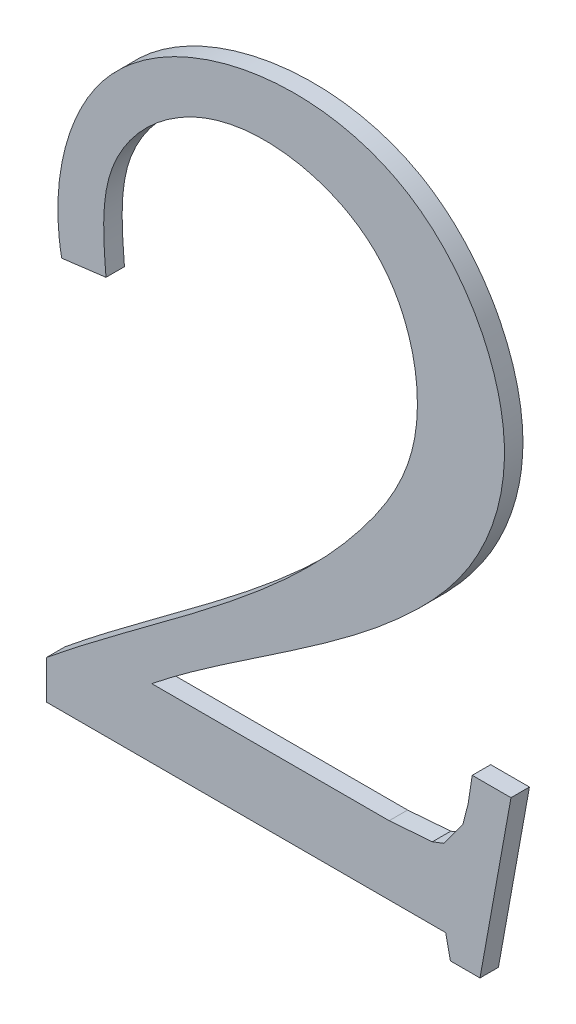
ISO-10303-21;
HEADER;
FILE_DESCRIPTION(('STEP AP214'),'2;1');
FILE_NAME('part.step','',(''),(''),'','','');
FILE_SCHEMA(('AUTOMOTIVE_DESIGN { 1 0 10303 214 1 1 1 1 }'));
ENDSEC;
DATA;
#1=APPLICATION_CONTEXT('core data for automotive mechanical design processes');
#2=APPLICATION_PROTOCOL_DEFINITION('international standard','automotive_design',2000,#1);
#3=PRODUCT_CONTEXT('',#1,'mechanical');
#4=PRODUCT('Part','Part','',(#3));
#5=PRODUCT_RELATED_PRODUCT_CATEGORY('part','',(#4));
#6=PRODUCT_DEFINITION_FORMATION('','',#4);
#7=PRODUCT_DEFINITION_CONTEXT('part definition',#1,'design');
#8=PRODUCT_DEFINITION('design','',#6,#7);
#9=PRODUCT_DEFINITION_SHAPE('','',#8);
#10=(LENGTH_UNIT() NAMED_UNIT(*) SI_UNIT(.MILLI.,.METRE.));
#11=(NAMED_UNIT(*) PLANE_ANGLE_UNIT() SI_UNIT($,.RADIAN.));
#12=(NAMED_UNIT(*) SI_UNIT($,.STERADIAN.) SOLID_ANGLE_UNIT());
#13=UNCERTAINTY_MEASURE_WITH_UNIT(LENGTH_MEASURE(1.E-05),#10,'distance_accuracy_value','');
#14=(GEOMETRIC_REPRESENTATION_CONTEXT(3) GLOBAL_UNCERTAINTY_ASSIGNED_CONTEXT((#13)) GLOBAL_UNIT_ASSIGNED_CONTEXT((#10,
#11,#12)) REPRESENTATION_CONTEXT('',''));
#15=CARTESIAN_POINT('',(0.,0.,0.));
#16=DIRECTION('',(0.,0.,1.));
#17=DIRECTION('',(1.,0.,0.));
#18=AXIS2_PLACEMENT_3D('',#15,#16,#17);
#19=CARTESIAN_POINT('',(0.,0.,0.05));
#20=DIRECTION('',(0.,0.,1.));
#21=DIRECTION('',(1.,0.,0.));
#22=AXIS2_PLACEMENT_3D('',#19,#20,#21);
#23=PLANE('',#22);
#24=CARTESIAN_POINT('',(3.09899999999998,-4.36099999999998,0.05));
#25=CARTESIAN_POINT('',(3.13352939431204,-4.3327277034328,0.05));
#26=CARTESIAN_POINT('',(3.16859484674987,-4.30514232488273,0.05));
#27=CARTESIAN_POINT('',(3.24012551636679,-4.25019745401624,0.05));
#28=CARTESIAN_POINT('',(3.27660459198674,-4.22285590486818,0.05));
#29=CARTESIAN_POINT('',(3.35027664214488,-4.16803937278579,0.05));
#30=CARTESIAN_POINT('',(3.38747233591294,-4.14056813136608,0.05));
#31=CARTESIAN_POINT('',(3.46187159716486,-4.08508870911011,0.05));
#32=CARTESIAN_POINT('',(3.49907336606711,-4.05707810668871,0.05));
#33=CARTESIAN_POINT('',(3.58193182663043,-3.99299562256812,0.05));
#34=CARTESIAN_POINT('',(3.62738534822964,-3.95665427807258,0.05));
#35=CARTESIAN_POINT('',(3.69375434500388,-3.90030765946178,0.05));
#36=CARTESIAN_POINT('',(3.71550353441927,-3.8812884015239,0.05));
#37=CARTESIAN_POINT('',(3.75830038447143,-3.84248086494116,0.05));
#38=CARTESIAN_POINT('',(3.77934818035898,-3.82269273617161,0.05));
#39=CARTESIAN_POINT('',(3.82037563149314,-3.7824350949379,0.05));
#40=CARTESIAN_POINT('',(3.84036383369619,-3.76197432585636,0.05));
#41=CARTESIAN_POINT('',(3.87932891248886,-3.72008487483054,0.05));
#42=CARTESIAN_POINT('',(3.89830523095192,-3.69865567052018,0.05));
#43=CARTESIAN_POINT('',(3.93495485714113,-3.65491457192806,0.05));
#44=CARTESIAN_POINT('',(3.95263478145768,-3.63260820529018,0.05));
#45=CARTESIAN_POINT('',(3.98658962397587,-3.58695907215511,0.05));
#46=CARTESIAN_POINT('',(4.00286606582264,-3.56361747231591,0.05));
#47=CARTESIAN_POINT('',(4.02568406306437,-3.52698506960837,0.05));
#48=CARTESIAN_POINT('',(4.03313861850895,-3.51426801070885,0.05));
#49=CARTESIAN_POINT('',(4.04720670900218,-3.48836266928158,0.05));
#50=CARTESIAN_POINT('',(4.05381973812304,-3.47517410933174,0.05));
#51=CARTESIAN_POINT('',(4.06591312810024,-3.44852618288967,0.05));
#52=CARTESIAN_POINT('',(4.07140926976051,-3.43507404633969,0.05));
#53=CARTESIAN_POINT('',(4.08121341058867,-3.40774348036995,0.05));
#54=CARTESIAN_POINT('',(4.08552177760331,-3.39386518441235,0.05));
#55=CARTESIAN_POINT('',(4.09282773279379,-3.3655280341554,0.05));
#56=CARTESIAN_POINT('',(4.09580340967906,-3.35106345940812,0.05));
#57=CARTESIAN_POINT('',(4.1003219855739,-3.32191491786917,0.05));
#58=CARTESIAN_POINT('',(4.1018643901066,-3.30723087713598,0.05));
#59=CARTESIAN_POINT('',(4.10447406804248,-3.26290643275941,0.05));
#60=CARTESIAN_POINT('',(4.10349267488836,-3.23312037481816,0.05));
#61=CARTESIAN_POINT('',(4.09657883772587,-3.17728059686551,0.05));
#62=CARTESIAN_POINT('',(4.09116817215635,-3.15115910553392,0.05));
#63=CARTESIAN_POINT('',(4.07587544287844,-3.10028665379651,0.05));
#64=CARTESIAN_POINT('',(4.06600672510193,-3.07553184843055,0.05));
#65=CARTESIAN_POINT('',(4.04483056113595,-3.03488848277747,0.05));
#66=CARTESIAN_POINT('',(4.03464201846329,-3.01841803732987,0.05));
#67=CARTESIAN_POINT('',(4.01163128664711,-2.98745734181578,0.05));
#68=CARTESIAN_POINT('',(3.99881569460674,-2.97296228004535,0.05));
#69=CARTESIAN_POINT('',(3.97078672731446,-2.94653102046192,0.05));
#70=CARTESIAN_POINT('',(3.95557344244173,-2.93459472623817,0.05));
#71=CARTESIAN_POINT('',(3.92344944002342,-2.91322641897108,0.05));
#72=CARTESIAN_POINT('',(3.90653389152021,-2.90380182687332,0.05));
#73=CARTESIAN_POINT('',(3.8657601065753,-2.88467382170508,0.05));
#74=CARTESIAN_POINT('',(3.84145948955657,-2.87591399434617,0.05));
#75=CARTESIAN_POINT('',(3.79177492697576,-2.86242790524104,0.05));
#76=CARTESIAN_POINT('',(3.76639002010206,-2.85770530417133,0.05));
#77=CARTESIAN_POINT('',(3.71483564264308,-2.85221661668814,0.05));
#78=CARTESIAN_POINT('',(3.68866019164282,-2.8515054568803,0.05));
#79=CARTESIAN_POINT('',(3.63655699634342,-2.85443952630193,0.05));
#80=CARTESIAN_POINT('',(3.61062913051664,-2.85808249439183,0.05));
#81=CARTESIAN_POINT('',(3.55935577427501,-2.8698894318201,0.05));
#82=CARTESIAN_POINT('',(3.53402710811174,-2.87812748292118,0.05));
#83=CARTESIAN_POINT('',(3.48526811110966,-2.89906560170328,0.05));
#84=CARTESIAN_POINT('',(3.46183906811663,-2.91176866581249,0.05));
#85=CARTESIAN_POINT('',(3.41882121675557,-2.94017818275806,0.05));
#86=CARTESIAN_POINT('',(3.39908893558122,-2.95566946636874,0.05));
#87=CARTESIAN_POINT('',(3.36241056878512,-2.98971400914532,0.05));
#88=CARTESIAN_POINT('',(3.34546653766641,-3.00826950616475,0.05));
#89=CARTESIAN_POINT('',(3.31793918809514,-3.04448321980532,0.05));
#90=CARTESIAN_POINT('',(3.30675942572382,-3.06168860919573,0.05));
#91=CARTESIAN_POINT('',(3.28739349142965,-3.09762852677776,0.05));
#92=CARTESIAN_POINT('',(3.27919093735984,-3.11635397105443,0.05));
#93=CARTESIAN_POINT('',(3.26958309727899,-3.14531152909724,0.05));
#94=CARTESIAN_POINT('',(3.26682988188559,-3.1551084656402,0.05));
#95=CARTESIAN_POINT('',(3.26221666821646,-3.17491207261595,0.05));
#96=CARTESIAN_POINT('',(3.26035695093026,-3.18491880799564,0.05));
#97=CARTESIAN_POINT('',(3.25587791167506,-3.21525329239229,0.05));
#98=CARTESIAN_POINT('',(3.25440371613718,-3.23574702536791,0.05));
#99=CARTESIAN_POINT('',(3.25339984089036,-3.27861167494059,0.05));
#100=CARTESIAN_POINT('',(3.25406113847422,-3.30098217108514,0.05));
#101=CARTESIAN_POINT('',(3.25650517279278,-3.34525057987553,0.05));
#102=CARTESIAN_POINT('',(3.25826663363007,-3.36714948358053,0.05));
#103=CARTESIAN_POINT('',(3.25999999999978,-3.38899999999532,0.05));
#104=B_SPLINE_CURVE_WITH_KNOTS('',3,(#24,#25,#26,#27,#28,#29,#30,#31,#32,#33,#34,#35,#36,#37,
#38,#39,#40,#41,#42,#43,#44,#45,#46,#47,#48,#49,#50,#51,#52,#53,#54,#55,#56,#57,#58,#59,#60,#61,
#62,#63,#64,#65,#66,#67,#68,#69,#70,#71,#72,#73,#74,#75,#76,#77,#78,#79,#80,#81,#82,#83,#84,#85,
#86,#87,#88,#89,#90,#91,#92,#93,#94,#95,#96,#97,#98,#99,#100,#101,#102,#103),.UNSPECIFIED.,.F.,
.F.,(4,2,2,2,2,2,2,2,2,2,2,2,2,2,2,2,2,2,2,2,2,2,2,2,2,2,2,2,2,2,2,2,2,2,2,2,2,2,2,4),(0.,
0.133845647964419,0.270600611062185,0.40932346862283,0.549025763928562,0.723540252798424,
0.810201759353854,0.896846456984278,0.982628673984437,1.06845772674373,1.15381283145847,
1.23907407485389,1.28327082380873,1.32749401967359,1.37104064706072,1.41457377312762,
1.45879849581211,1.50303847030282,1.59190383336916,1.67159177449509,1.7510427212379,
1.80891288021117,1.86663945659107,1.92436385753232,1.98225696332462,2.05934478747787,
2.13650243560371,2.21471404584981,2.29288505771214,2.37235436568433,2.45187710690576,
2.52681883411,2.60181553672056,2.66314364806958,2.72412899251449,2.75461879569307,
2.78511818111494,2.84657644461402,2.91367789009511,2.97952022189874),.UNSPECIFIED.);
#105=CARTESIAN_POINT('',(3.09899999999999,-4.36099999999999,0.05));
#106=VERTEX_POINT('',#105);
#107=CARTESIAN_POINT('',(3.25999999999997,-3.38899999999765,0.05));
#108=VERTEX_POINT('',#107);
#109=EDGE_CURVE('E152',#106,#108,#104,.T.);
#110=ORIENTED_EDGE('',*,*,#109,.F.);
#111=DIRECTION('',(0.,1.,0.));
#112=VECTOR('',#111,1.);
#113=CARTESIAN_POINT('',(3.099,-4.361,0.05));
#114=LINE('',#113,#112);
#115=CARTESIAN_POINT('',(3.099,-4.466,0.05));
#116=VERTEX_POINT('',#115);
#117=EDGE_CURVE('E149',#116,#106,#114,.T.);
#118=ORIENTED_EDGE('',*,*,#117,.F.);
#119=DIRECTION('',(1.,0.,0.));
#120=VECTOR('',#119,1.);
#121=CARTESIAN_POINT('',(3.099,-4.466,0.05));
#122=LINE('',#121,#120);
#123=CARTESIAN_POINT('',(4.18,-4.466,0.05));
#124=VERTEX_POINT('',#123);
#125=EDGE_CURVE('E140',#124,#116,#122,.F.);
#126=ORIENTED_EDGE('',*,*,#125,.F.);
#127=DIRECTION('',(0.2117533470058,-0.977323140026799,0.));
#128=VECTOR('',#127,1.);
#129=CARTESIAN_POINT('',(4.18,-4.466,0.05));
#130=LINE('',#129,#128);
#131=CARTESIAN_POINT('',(4.193,-4.526,0.05));
#132=VERTEX_POINT('',#131);
#133=EDGE_CURVE('E135',#132,#124,#130,.F.);
#134=ORIENTED_EDGE('',*,*,#133,.F.);
#135=DIRECTION('',(1.,0.,0.));
#136=VECTOR('',#135,1.);
#137=CARTESIAN_POINT('',(4.193,-4.526,0.05));
#138=LINE('',#137,#136);
#139=CARTESIAN_POINT('',(4.273,-4.526,0.05));
#140=VERTEX_POINT('',#139);
#141=EDGE_CURVE('E213',#140,#132,#138,.F.);
#142=ORIENTED_EDGE('',*,*,#141,.F.);
#143=DIRECTION('',(0.177767924449604,0.98407243891742,0.));
#144=VECTOR('',#143,1.);
#145=CARTESIAN_POINT('',(4.273,-4.526,0.05));
#146=LINE('',#145,#144);
#147=CARTESIAN_POINT('',(4.357,-4.061,0.05));
#148=VERTEX_POINT('',#147);
#149=EDGE_CURVE('E208',#148,#140,#146,.F.);
#150=ORIENTED_EDGE('',*,*,#149,.F.);
#151=DIRECTION('',(1.,0.,0.));
#152=VECTOR('',#151,1.);
#153=CARTESIAN_POINT('',(4.357,-4.061,0.05));
#154=LINE('',#153,#152);
#155=CARTESIAN_POINT('',(4.252,-4.061,0.05));
#156=VERTEX_POINT('',#155);
#157=EDGE_CURVE('E203',#156,#148,#154,.T.);
#158=ORIENTED_EDGE('',*,*,#157,.F.);
#159=DIRECTION('',(-0.151025398741503,-0.988529882671723,0.));
#160=VECTOR('',#159,1.);
#161=CARTESIAN_POINT('',(4.252,-4.061,0.05));
#162=LINE('',#161,#160);
#163=CARTESIAN_POINT('',(4.241,-4.133,0.05));
#164=VERTEX_POINT('',#163);
#165=EDGE_CURVE('E198',#164,#156,#162,.F.);
#166=ORIENTED_EDGE('',*,*,#165,.F.);
#167=DIRECTION('',(-0.246679280634912,-0.969097173922947,0.));
#168=VECTOR('',#167,1.);
#169=CARTESIAN_POINT('',(4.241,-4.133,0.05));
#170=LINE('',#169,#168);
#171=CARTESIAN_POINT('',(4.227,-4.188,0.05));
#172=VERTEX_POINT('',#171);
#173=EDGE_CURVE('E193',#172,#164,#170,.F.);
#174=ORIENTED_EDGE('',*,*,#173,.F.);
#175=DIRECTION('',(-0.590870941899023,-0.806766093746732,0.));
#176=VECTOR('',#175,1.);
#177=CARTESIAN_POINT('',(4.227,-4.188,0.05));
#178=LINE('',#177,#176);
#179=CARTESIAN_POINT('',(4.175,-4.259,0.05));
#180=VERTEX_POINT('',#179);
#181=EDGE_CURVE('E188',#180,#172,#178,.F.);
#182=ORIENTED_EDGE('',*,*,#181,.F.);
#183=DIRECTION('',(-0.932568098274095,-0.360994102557698,0.));
#184=VECTOR('',#183,1.);
#185=CARTESIAN_POINT('',(4.175,-4.259,0.05));
#186=LINE('',#185,#184);
#187=CARTESIAN_POINT('',(4.144,-4.271,0.05));
#188=VERTEX_POINT('',#187);
#189=EDGE_CURVE('E183',#188,#180,#186,.F.);
#190=ORIENTED_EDGE('',*,*,#189,.F.);
#191=DIRECTION('',(-0.997054485501581,-0.0766964988847386,0.));
#192=VECTOR('',#191,1.);
#193=CARTESIAN_POINT('',(4.144,-4.271,0.05));
#194=LINE('',#193,#192);
#195=CARTESIAN_POINT('',(4.027,-4.28,0.05));
#196=VERTEX_POINT('',#195);
#197=EDGE_CURVE('E178',#196,#188,#194,.F.);
#198=ORIENTED_EDGE('',*,*,#197,.F.);
#199=DIRECTION('',(1.,0.,0.));
#200=VECTOR('',#199,1.);
#201=CARTESIAN_POINT('',(4.027,-4.28,0.05));
#202=LINE('',#201,#200);
#203=CARTESIAN_POINT('',(3.3839999999999,-4.27999999999991,0.05));
#204=VERTEX_POINT('',#203);
#205=EDGE_CURVE('E76',#204,#196,#202,.T.);
#206=ORIENTED_EDGE('',*,*,#205,.F.);
#207=CARTESIAN_POINT('',(3.13999999999985,-3.40400000000003,0.05));
#208=CARTESIAN_POINT('',(3.1336319380678,-3.37132461745013,0.05));
#209=CARTESIAN_POINT('',(3.13023838823719,-3.33814098577875,0.05));
#210=CARTESIAN_POINT('',(3.12907710470549,-3.27156584397108,0.05));
#211=CARTESIAN_POINT('',(3.13132631759601,-3.23817400879364,0.05));
#212=CARTESIAN_POINT('',(3.1411478468347,-3.17229227837566,0.05));
#213=CARTESIAN_POINT('',(3.14870501721944,-3.13980008958831,0.05));
#214=CARTESIAN_POINT('',(3.16904594978592,-3.07651850993753,0.05));
#215=CARTESIAN_POINT('',(3.1818237281516,-3.04572721524143,0.05));
#216=CARTESIAN_POINT('',(3.21290644872305,-2.98644018770735,0.05));
#217=CARTESIAN_POINT('',(3.23128924081867,-2.95798445733268,0.05));
#218=CARTESIAN_POINT('',(3.27336314899692,-2.90534490298126,0.05));
#219=CARTESIAN_POINT('',(3.29705032766754,-2.88115793402156,0.05));
#220=CARTESIAN_POINT('',(3.3452100068164,-2.84008944276196,0.05));
#221=CARTESIAN_POINT('',(3.369241347045,-2.82267823190318,0.05));
#222=CARTESIAN_POINT('',(3.419533719719,-2.79142049869575,0.05));
#223=CARTESIAN_POINT('',(3.44579689603444,-2.77757745654272,0.05));
#224=CARTESIAN_POINT('',(3.5046010258046,-2.75124461460932,0.05));
#225=CARTESIAN_POINT('',(3.53743642033382,-2.73941527787589,0.05));
#226=CARTESIAN_POINT('',(3.60445022836033,-2.72041253930644,0.05));
#227=CARTESIAN_POINT('',(3.63863011406719,-2.71324440096033,0.05));
#228=CARTESIAN_POINT('',(3.71416806632083,-2.7028719679045,0.05));
#229=CARTESIAN_POINT('',(3.7556687845772,-2.70066480760537,0.05));
#230=CARTESIAN_POINT('',(3.83840294244927,-2.70378036166895,0.05));
#231=CARTESIAN_POINT('',(3.87963667380504,-2.70909259363159,0.05));
#232=CARTESIAN_POINT('',(3.94831843858288,-2.72536606046069,0.05));
#233=CARTESIAN_POINT('',(3.97626759355896,-2.7342175971058,0.05));
#234=CARTESIAN_POINT('',(4.03029913897755,-2.75639804950477,0.05));
#235=CARTESIAN_POINT('',(4.05638586238865,-2.76971613276512,0.05));
#236=CARTESIAN_POINT('',(4.10575641022146,-2.80092708681317,0.05));
#237=CARTESIAN_POINT('',(4.12903279699091,-2.81883172179467,0.05));
#238=CARTESIAN_POINT('',(4.17230789819218,-2.8582676194182,0.05));
#239=CARTESIAN_POINT('',(4.19230022526482,-2.87980578808093,0.05));
#240=CARTESIAN_POINT('',(4.22880224450531,-2.92565475400306,0.05));
#241=CARTESIAN_POINT('',(4.24531020403125,-2.94996692145188,0.05));
#242=CARTESIAN_POINT('',(4.2746515761528,-3.00072564562053,0.05));
#243=CARTESIAN_POINT('',(4.28748286361139,-3.02717342546224,0.05));
#244=CARTESIAN_POINT('',(4.31084594992179,-3.08579597327929,0.05));
#245=CARTESIAN_POINT('',(4.32073295857156,-3.11823063566766,0.05));
#246=CARTESIAN_POINT('',(4.33463078464326,-3.18437067226359,0.05));
#247=CARTESIAN_POINT('',(4.33864360200055,-3.21807560998073,0.05));
#248=CARTESIAN_POINT('',(4.33984649030719,-3.28353236883508,0.05));
#249=CARTESIAN_POINT('',(4.33744093861082,-3.31527684140705,0.05));
#250=CARTESIAN_POINT('',(4.32722259931463,-3.37785723626544,0.05));
#251=CARTESIAN_POINT('',(4.31940961501276,-3.40869312545847,0.05));
#252=CARTESIAN_POINT('',(4.30433604152708,-3.45336226967018,0.05));
#253=CARTESIAN_POINT('',(4.29883901816982,-3.46782082365801,0.05));
#254=CARTESIAN_POINT('',(4.28681873485304,-3.49628987638847,0.05));
#255=CARTESIAN_POINT('',(4.28029659392491,-3.51030084388619,0.05));
#256=CARTESIAN_POINT('',(4.2663043574938,-3.53781475641411,0.05));
#257=CARTESIAN_POINT('',(4.25883559492855,-3.55131838182578,0.05));
#258=CARTESIAN_POINT('',(4.24299546142959,-3.57778697744602,0.05));
#259=CARTESIAN_POINT('',(4.23462394460399,-3.59075186011928,0.05));
#260=CARTESIAN_POINT('',(4.1932377514839,-3.65062076367517,0.05));
#261=CARTESIAN_POINT('',(4.15509606919874,-3.69397841053866,0.05));
#262=CARTESIAN_POINT('',(4.09391735006805,-3.75513907107834,0.05));
#263=CARTESIAN_POINT('',(4.07270926369836,-3.7749984789705,0.05));
#264=CARTESIAN_POINT('',(4.02932866760596,-3.81362771732887,0.05));
#265=CARTESIAN_POINT('',(4.00715700709046,-3.83239847448485,0.05));
#266=CARTESIAN_POINT('',(3.95200306639138,-3.87714712805556,0.05));
#267=CARTESIAN_POINT('',(3.91860724374126,-3.90260805552536,0.05));
#268=CARTESIAN_POINT('',(3.85081270909551,-3.95220303239454,0.05));
#269=CARTESIAN_POINT('',(3.81641312914981,-3.97633587804089,0.05));
#270=CARTESIAN_POINT('',(3.74711318827527,-4.02393911260466,0.05));
#271=CARTESIAN_POINT('',(3.71221235303101,-4.0474088018517,0.05));
#272=CARTESIAN_POINT('',(3.64405716343579,-4.09324308169791,0.05));
#273=CARTESIAN_POINT('',(3.61080271862092,-4.11560763385671,0.05));
#274=CARTESIAN_POINT('',(3.54473010864882,-4.16091567184981,0.05));
#275=CARTESIAN_POINT('',(3.51191153617377,-4.18385854913529,0.05));
#276=CARTESIAN_POINT('',(3.44717417210813,-4.23090713830955,0.05));
#277=CARTESIAN_POINT('',(3.41525452123597,-4.25501167554468,0.05));
#278=CARTESIAN_POINT('',(3.38399999999989,-4.27999999999989,0.05));
#279=B_SPLINE_CURVE_WITH_KNOTS('',3,(#207,#208,#209,#210,#211,#212,#213,#214,#215,#216,#217,
#218,#219,#220,#221,#222,#223,#224,#225,#226,#227,#228,#229,#230,#231,#232,#233,#234,#235,#236,
#237,#238,#239,#240,#241,#242,#243,#244,#245,#246,#247,#248,#249,#250,#251,#252,#253,#254,#255,
#256,#257,#258,#259,#260,#261,#262,#263,#264,#265,#266,#267,#268,#269,#270,#271,#272,#273,#274,
#275,#276,#277,#278),.UNSPECIFIED.,.F.,.F.,(4,2,2,2,2,2,2,2,2,2,2,2,2,2,2,2,2,2,2,2,2,2,2,2,2,2,
2,2,2,2,2,2,2,2,2,4),(0.,0.099634749485122,0.199569084389647,0.299219414593413,
0.398755845446889,0.499743133096994,0.600655705564105,0.689368198208153,0.778166891502307,
0.882501093106952,0.986952906684348,1.11101940011907,1.23491310903959,1.32252730673755,
1.40993053643928,1.49756023425907,1.58535840028799,1.67320012264379,1.7610925160572,
1.86232773231922,1.96352847387565,2.05850607450569,2.15348713024527,2.19986001407392,
2.24618262381862,2.29244071666172,2.3387062963955,2.51074016795653,2.59792127483799,
2.68502704734184,2.81095959661212,2.93700447032465,3.06317770731489,3.18340553949646,
3.30351174668153,3.42349895318845),.UNSPECIFIED.);
#280=CARTESIAN_POINT('',(3.13999999999992,-3.40400000000001,0.05));
#281=VERTEX_POINT('',#280);
#282=EDGE_CURVE('E21',#281,#204,#279,.T.);
#283=ORIENTED_EDGE('',*,*,#282,.F.);
#284=DIRECTION('',(0.992277876713669,0.124034734589196,0.));
#285=VECTOR('',#284,1.);
#286=CARTESIAN_POINT('',(3.14,-3.404,0.05));
#287=LINE('',#286,#285);
#288=EDGE_CURVE('E63',#108,#281,#287,.F.);
#289=ORIENTED_EDGE('',*,*,#288,.F.);
#290=EDGE_LOOP('',(#110,#118,#126,#134,#142,#150,#158,#166,#174,#182,#190,#198,#206,#283,#289));
#291=FACE_BOUND('',#290,.T.);
#292=ADVANCED_FACE('F17',(#291),#23,.T.);
#293=CARTESIAN_POINT('',(3.099,-4.361,0.));
#294=DIRECTION('',(-1.,0.,0.));
#295=DIRECTION('',(0.,0.,1.));
#296=AXIS2_PLACEMENT_3D('',#293,#294,#295);
#297=PLANE('',#296);
#298=DIRECTION('',(0.,0.,1.));
#299=VECTOR('',#298,1.);
#300=CARTESIAN_POINT('',(3.09899999999998,-4.36099999999998,0.));
#301=LINE('',#300,#299);
#302=CARTESIAN_POINT('',(3.09899999999999,-4.36099999999999,0.));
#303=VERTEX_POINT('',#302);
#304=EDGE_CURVE('E250',#303,#106,#301,.T.);
#305=ORIENTED_EDGE('',*,*,#304,.F.);
#306=DIRECTION('',(0.,1.,0.));
#307=VECTOR('',#306,1.);
#308=CARTESIAN_POINT('',(3.099,0.,0.));
#309=LINE('',#308,#307);
#310=CARTESIAN_POINT('',(3.099,-4.466,0.));
#311=VERTEX_POINT('',#310);
#312=EDGE_CURVE('E159',#303,#311,#309,.F.);
#313=ORIENTED_EDGE('',*,*,#312,.T.);
#314=DIRECTION('',(0.,0.,-1.));
#315=VECTOR('',#314,1.);
#316=CARTESIAN_POINT('',(3.099,-4.466,0.));
#317=LINE('',#316,#315);
#318=EDGE_CURVE('E145',#116,#311,#317,.T.);
#319=ORIENTED_EDGE('',*,*,#318,.F.);
#320=ORIENTED_EDGE('',*,*,#117,.T.);
#321=EDGE_LOOP('',(#305,#313,#319,#320));
#322=FACE_BOUND('',#321,.T.);
#323=ADVANCED_FACE('F158',(#322),#297,.T.);
#324=CARTESIAN_POINT('',(3.099,-4.466,0.));
#325=DIRECTION('',(0.,-1.,0.));
#326=DIRECTION('',(0.,0.,-1.));
#327=AXIS2_PLACEMENT_3D('',#324,#325,#326);
#328=PLANE('',#327);
#329=ORIENTED_EDGE('',*,*,#318,.T.);
#330=DIRECTION('',(1.,0.,0.));
#331=VECTOR('',#330,1.);
#332=CARTESIAN_POINT('',(0.,-4.466,0.));
#333=LINE('',#332,#331);
#334=CARTESIAN_POINT('',(4.18,-4.466,0.));
#335=VERTEX_POINT('',#334);
#336=EDGE_CURVE('E329',#311,#335,#333,.T.);
#337=ORIENTED_EDGE('',*,*,#336,.T.);
#338=DIRECTION('',(0.,0.,1.));
#339=VECTOR('',#338,1.);
#340=CARTESIAN_POINT('',(4.18,-4.466,0.));
#341=LINE('',#340,#339);
#342=EDGE_CURVE('E147',#124,#335,#341,.F.);
#343=ORIENTED_EDGE('',*,*,#342,.F.);
#344=ORIENTED_EDGE('',*,*,#125,.T.);
#345=EDGE_LOOP('',(#329,#337,#343,#344));
#346=FACE_BOUND('',#345,.T.);
#347=ADVANCED_FACE('F142',(#346),#328,.T.);
#348=CARTESIAN_POINT('',(4.18,-4.466,0.));
#349=DIRECTION('',(-0.977323140026799,-0.2117533470058,0.));
#350=DIRECTION('',(0.2117533470058,-0.977323140026799,0.));
#351=AXIS2_PLACEMENT_3D('',#348,#349,#350);
#352=PLANE('',#351);
#353=ORIENTED_EDGE('',*,*,#342,.T.);
#354=DIRECTION('',(0.211753347005808,-0.977323140026797,0.));
#355=VECTOR('',#354,1.);
#356=CARTESIAN_POINT('',(4.18,-4.466,0.));
#357=LINE('',#356,#355);
#358=CARTESIAN_POINT('',(4.193,-4.526,0.));
#359=VERTEX_POINT('',#358);
#360=EDGE_CURVE('E330',#335,#359,#357,.T.);
#361=ORIENTED_EDGE('',*,*,#360,.T.);
#362=DIRECTION('',(0.,0.,-1.));
#363=VECTOR('',#362,1.);
#364=CARTESIAN_POINT('',(4.193,-4.526,0.));
#365=LINE('',#364,#363);
#366=EDGE_CURVE('E210',#132,#359,#365,.T.);
#367=ORIENTED_EDGE('',*,*,#366,.F.);
#368=ORIENTED_EDGE('',*,*,#133,.T.);
#369=EDGE_LOOP('',(#353,#361,#367,#368));
#370=FACE_BOUND('',#369,.T.);
#371=ADVANCED_FACE('F300',(#370),#352,.T.);
#372=CARTESIAN_POINT('',(4.193,-4.526,0.));
#373=DIRECTION('',(0.,-1.,0.));
#374=DIRECTION('',(0.,0.,-1.));
#375=AXIS2_PLACEMENT_3D('',#372,#373,#374);
#376=PLANE('',#375);
#377=ORIENTED_EDGE('',*,*,#366,.T.);
#378=DIRECTION('',(1.,0.,0.));
#379=VECTOR('',#378,1.);
#380=CARTESIAN_POINT('',(0.,-4.526,0.));
#381=LINE('',#380,#379);
#382=CARTESIAN_POINT('',(4.273,-4.526,0.));
#383=VERTEX_POINT('',#382);
#384=EDGE_CURVE('E332',#359,#383,#381,.T.);
#385=ORIENTED_EDGE('',*,*,#384,.T.);
#386=DIRECTION('',(0.,0.,1.));
#387=VECTOR('',#386,1.);
#388=CARTESIAN_POINT('',(4.273,-4.526,0.));
#389=LINE('',#388,#387);
#390=EDGE_CURVE('E205',#140,#383,#389,.F.);
#391=ORIENTED_EDGE('',*,*,#390,.F.);
#392=ORIENTED_EDGE('',*,*,#141,.T.);
#393=EDGE_LOOP('',(#377,#385,#391,#392));
#394=FACE_BOUND('',#393,.T.);
#395=ADVANCED_FACE('F296',(#394),#376,.T.);
#396=CARTESIAN_POINT('',(4.273,-4.526,0.));
#397=DIRECTION('',(0.98407243891742,-0.177767924449604,0.));
#398=DIRECTION('',(0.177767924449604,0.98407243891742,0.));
#399=AXIS2_PLACEMENT_3D('',#396,#397,#398);
#400=PLANE('',#399);
#401=ORIENTED_EDGE('',*,*,#390,.T.);
#402=DIRECTION('',(0.1777679244496,0.984072438917421,0.));
#403=VECTOR('',#402,1.);
#404=CARTESIAN_POINT('',(4.273,-4.526,0.));
#405=LINE('',#404,#403);
#406=CARTESIAN_POINT('',(4.357,-4.061,0.));
#407=VERTEX_POINT('',#406);
#408=EDGE_CURVE('E347',#383,#407,#405,.T.);
#409=ORIENTED_EDGE('',*,*,#408,.T.);
#410=DIRECTION('',(0.,0.,1.));
#411=VECTOR('',#410,1.);
#412=CARTESIAN_POINT('',(4.357,-4.061,0.));
#413=LINE('',#412,#411);
#414=EDGE_CURVE('E200',#148,#407,#413,.F.);
#415=ORIENTED_EDGE('',*,*,#414,.F.);
#416=ORIENTED_EDGE('',*,*,#149,.T.);
#417=EDGE_LOOP('',(#401,#409,#415,#416));
#418=FACE_BOUND('',#417,.T.);
#419=ADVANCED_FACE('F292',(#418),#400,.T.);
#420=CARTESIAN_POINT('',(4.357,-4.061,0.));
#421=DIRECTION('',(0.,1.,0.));
#422=DIRECTION('',(0.,0.,1.));
#423=AXIS2_PLACEMENT_3D('',#420,#421,#422);
#424=PLANE('',#423);
#425=ORIENTED_EDGE('',*,*,#414,.T.);
#426=DIRECTION('',(1.,0.,0.));
#427=VECTOR('',#426,1.);
#428=CARTESIAN_POINT('',(0.,-4.061,0.));
#429=LINE('',#428,#427);
#430=CARTESIAN_POINT('',(4.252,-4.061,0.));
#431=VERTEX_POINT('',#430);
#432=EDGE_CURVE('E355',#407,#431,#429,.F.);
#433=ORIENTED_EDGE('',*,*,#432,.T.);
#434=DIRECTION('',(0.,0.,1.));
#435=VECTOR('',#434,1.);
#436=CARTESIAN_POINT('',(4.252,-4.061,0.));
#437=LINE('',#436,#435);
#438=EDGE_CURVE('E195',#156,#431,#437,.F.);
#439=ORIENTED_EDGE('',*,*,#438,.F.);
#440=ORIENTED_EDGE('',*,*,#157,.T.);
#441=EDGE_LOOP('',(#425,#433,#439,#440));
#442=FACE_BOUND('',#441,.T.);
#443=ADVANCED_FACE('F288',(#442),#424,.T.);
#444=CARTESIAN_POINT('',(4.252,-4.061,0.));
#445=DIRECTION('',(-0.988529882671723,0.151025398741503,0.));
#446=DIRECTION('',(-0.151025398741503,-0.988529882671723,0.));
#447=AXIS2_PLACEMENT_3D('',#444,#445,#446);
#448=PLANE('',#447);
#449=ORIENTED_EDGE('',*,*,#438,.T.);
#450=DIRECTION('',(-0.151025398741509,-0.988529882671722,0.));
#451=VECTOR('',#450,1.);
#452=CARTESIAN_POINT('',(4.252,-4.061,0.));
#453=LINE('',#452,#451);
#454=CARTESIAN_POINT('',(4.241,-4.133,0.));
#455=VERTEX_POINT('',#454);
#456=EDGE_CURVE('E363',#431,#455,#453,.T.);
#457=ORIENTED_EDGE('',*,*,#456,.T.);
#458=DIRECTION('',(0.,0.,1.));
#459=VECTOR('',#458,1.);
#460=CARTESIAN_POINT('',(4.241,-4.133,0.));
#461=LINE('',#460,#459);
#462=EDGE_CURVE('E190',#164,#455,#461,.F.);
#463=ORIENTED_EDGE('',*,*,#462,.F.);
#464=ORIENTED_EDGE('',*,*,#165,.T.);
#465=EDGE_LOOP('',(#449,#457,#463,#464));
#466=FACE_BOUND('',#465,.T.);
#467=ADVANCED_FACE('F284',(#466),#448,.T.);
#468=CARTESIAN_POINT('',(4.241,-4.133,0.));
#469=DIRECTION('',(-0.969097173922947,0.246679280634912,0.));
#470=DIRECTION('',(-0.246679280634912,-0.969097173922947,0.));
#471=AXIS2_PLACEMENT_3D('',#468,#469,#470);
#472=PLANE('',#471);
#473=ORIENTED_EDGE('',*,*,#462,.T.);
#474=DIRECTION('',(-0.246679280634921,-0.969097173922945,0.));
#475=VECTOR('',#474,1.);
#476=CARTESIAN_POINT('',(4.241,-4.133,0.));
#477=LINE('',#476,#475);
#478=CARTESIAN_POINT('',(4.227,-4.188,0.));
#479=VERTEX_POINT('',#478);
#480=EDGE_CURVE('E371',#455,#479,#477,.T.);
#481=ORIENTED_EDGE('',*,*,#480,.T.);
#482=DIRECTION('',(0.,0.,1.));
#483=VECTOR('',#482,1.);
#484=CARTESIAN_POINT('',(4.227,-4.188,0.));
#485=LINE('',#484,#483);
#486=EDGE_CURVE('E185',#172,#479,#485,.F.);
#487=ORIENTED_EDGE('',*,*,#486,.F.);
#488=ORIENTED_EDGE('',*,*,#173,.T.);
#489=EDGE_LOOP('',(#473,#481,#487,#488));
#490=FACE_BOUND('',#489,.T.);
#491=ADVANCED_FACE('F280',(#490),#472,.T.);
#492=CARTESIAN_POINT('',(4.227,-4.188,0.));
#493=DIRECTION('',(-0.806766093746732,0.590870941899023,0.));
#494=DIRECTION('',(-0.590870941899023,-0.806766093746732,0.));
#495=AXIS2_PLACEMENT_3D('',#492,#493,#494);
#496=PLANE('',#495);
#497=ORIENTED_EDGE('',*,*,#486,.T.);
#498=DIRECTION('',(-0.59087094189902,-0.806766093746734,0.));
#499=VECTOR('',#498,1.);
#500=CARTESIAN_POINT('',(4.227,-4.188,0.));
#501=LINE('',#500,#499);
#502=CARTESIAN_POINT('',(4.175,-4.259,0.));
#503=VERTEX_POINT('',#502);
#504=EDGE_CURVE('E379',#479,#503,#501,.T.);
#505=ORIENTED_EDGE('',*,*,#504,.T.);
#506=DIRECTION('',(0.,0.,1.));
#507=VECTOR('',#506,1.);
#508=CARTESIAN_POINT('',(4.175,-4.259,0.));
#509=LINE('',#508,#507);
#510=EDGE_CURVE('E180',#180,#503,#509,.F.);
#511=ORIENTED_EDGE('',*,*,#510,.F.);
#512=ORIENTED_EDGE('',*,*,#181,.T.);
#513=EDGE_LOOP('',(#497,#505,#511,#512));
#514=FACE_BOUND('',#513,.T.);
#515=ADVANCED_FACE('F276',(#514),#496,.T.);
#516=CARTESIAN_POINT('',(4.175,-4.259,0.));
#517=DIRECTION('',(-0.360994102557698,0.932568098274095,0.));
#518=DIRECTION('',(-0.932568098274095,-0.360994102557698,0.));
#519=AXIS2_PLACEMENT_3D('',#516,#517,#518);
#520=PLANE('',#519);
#521=ORIENTED_EDGE('',*,*,#510,.T.);
#522=DIRECTION('',(-0.932568098274099,-0.360994102557688,0.));
#523=VECTOR('',#522,1.);
#524=CARTESIAN_POINT('',(4.175,-4.259,0.));
#525=LINE('',#524,#523);
#526=CARTESIAN_POINT('',(4.144,-4.271,0.));
#527=VERTEX_POINT('',#526);
#528=EDGE_CURVE('E325',#503,#527,#525,.T.);
#529=ORIENTED_EDGE('',*,*,#528,.T.);
#530=DIRECTION('',(0.,0.,1.));
#531=VECTOR('',#530,1.);
#532=CARTESIAN_POINT('',(4.144,-4.271,0.));
#533=LINE('',#532,#531);
#534=EDGE_CURVE('E175',#188,#527,#533,.F.);
#535=ORIENTED_EDGE('',*,*,#534,.F.);
#536=ORIENTED_EDGE('',*,*,#189,.T.);
#537=EDGE_LOOP('',(#521,#529,#535,#536));
#538=FACE_BOUND('',#537,.T.);
#539=ADVANCED_FACE('F272',(#538),#520,.T.);
#540=CARTESIAN_POINT('',(4.144,-4.271,0.));
#541=DIRECTION('',(-0.0766964988847386,0.997054485501581,0.));
#542=DIRECTION('',(-0.997054485501581,-0.0766964988847386,0.));
#543=AXIS2_PLACEMENT_3D('',#540,#541,#542);
#544=PLANE('',#543);
#545=ORIENTED_EDGE('',*,*,#534,.T.);
#546=DIRECTION('',(-0.997054485501581,-0.0766964988847399,0.));
#547=VECTOR('',#546,1.);
#548=CARTESIAN_POINT('',(4.144,-4.271,0.));
#549=LINE('',#548,#547);
#550=CARTESIAN_POINT('',(4.02700000000005,-4.28,0.));
#551=VERTEX_POINT('',#550);
#552=EDGE_CURVE('E322',#527,#551,#549,.T.);
#553=ORIENTED_EDGE('',*,*,#552,.T.);
#554=DIRECTION('',(0.,0.,1.));
#555=VECTOR('',#554,1.);
#556=CARTESIAN_POINT('',(4.027,-4.28,0.));
#557=LINE('',#556,#555);
#558=EDGE_CURVE('E174',#196,#551,#557,.F.);
#559=ORIENTED_EDGE('',*,*,#558,.F.);
#560=ORIENTED_EDGE('',*,*,#197,.T.);
#561=EDGE_LOOP('',(#545,#553,#559,#560));
#562=FACE_BOUND('',#561,.T.);
#563=ADVANCED_FACE('F269',(#562),#544,.T.);
#564=CARTESIAN_POINT('',(4.027,-4.28,0.));
#565=DIRECTION('',(0.,1.,0.));
#566=DIRECTION('',(0.,0.,1.));
#567=AXIS2_PLACEMENT_3D('',#564,#565,#566);
#568=PLANE('',#567);
#569=ORIENTED_EDGE('',*,*,#558,.T.);
#570=DIRECTION('',(1.,0.,0.));
#571=VECTOR('',#570,1.);
#572=CARTESIAN_POINT('',(0.,-4.28,0.));
#573=LINE('',#572,#571);
#574=CARTESIAN_POINT('',(3.3839999999999,-4.27999999999991,0.));
#575=VERTEX_POINT('',#574);
#576=EDGE_CURVE('E321',#551,#575,#573,.F.);
#577=ORIENTED_EDGE('',*,*,#576,.T.);
#578=DIRECTION('',(0.,0.,1.));
#579=VECTOR('',#578,1.);
#580=CARTESIAN_POINT('',(3.3839999999999,-4.27999999999988,0.));
#581=LINE('',#580,#579);
#582=EDGE_CURVE('E169',#204,#575,#581,.F.);
#583=ORIENTED_EDGE('',*,*,#582,.F.);
#584=ORIENTED_EDGE('',*,*,#205,.T.);
#585=EDGE_LOOP('',(#569,#577,#583,#584));
#586=FACE_BOUND('',#585,.T.);
#587=ADVANCED_FACE('F265',(#586),#568,.T.);
#588=CARTESIAN_POINT('',(3.357416645604,-4.301618800403,0.));
#589=CARTESIAN_POINT('',(3.366212488632,-4.294340937828,0.));
#590=CARTESIAN_POINT('',(3.497120951655,-4.187935281725,0.));
#591=CARTESIAN_POINT('',(3.756636878886,-4.022969914619,0.));
#592=CARTESIAN_POINT('',(4.058757500646,-3.802944555549,0.));
#593=CARTESIAN_POINT('',(4.277913944748,-3.55811706304,0.));
#594=CARTESIAN_POINT('',(4.398913207462,-3.192889962739,0.));
#595=CARTESIAN_POINT('',(4.136408018534,-2.696124311815,0.));
#596=CARTESIAN_POINT('',(3.586578277314,-2.673431815959,0.));
#597=CARTESIAN_POINT('',(3.230262232882,-2.901760790671,0.));
#598=CARTESIAN_POINT('',(3.123734684304,-3.17839323513,0.));
#599=CARTESIAN_POINT('',(3.128550851291,-3.35577578234,0.));
#600=CARTESIAN_POINT('',(3.144732499064,-3.42623209209,0.));
#601=CARTESIAN_POINT('',(3.14762511827,-3.43716126573,0.));
#602=(BOUNDED_CURVE() B_SPLINE_CURVE(3,(#588,#589,#590,#591,#592,#593,#594,#595,#596,#597,#598,
#599,#600,#601),.UNSPECIFIED.,.F.,.F.) B_SPLINE_CURVE_WITH_KNOTS((4,1,1,1,1,1,1,1,1,1,1,4),(0.,
0.01003024842985,0.1481485127419,0.2664086995746,0.3350007519901,0.4320902501912,
0.5845873745623,0.7450427370763,0.8485350951842,0.9361129489828,0.9899691601952,1.),
.UNSPECIFIED.) CURVE() GEOMETRIC_REPRESENTATION_ITEM() RATIONAL_B_SPLINE_CURVE((1.,1.,1.,1.,1.,
1.,1.,1.,1.,1.,1.,1.,1.,1.)) REPRESENTATION_ITEM(''));
#603=DIRECTION('',(0.,0.,1.));
#604=VECTOR('',#603,1.);
#605=SURFACE_OF_LINEAR_EXTRUSION('',#602,#604);
#606=ORIENTED_EDGE('',*,*,#582,.T.);
#607=CARTESIAN_POINT('',(3.3839999999999,-4.27999999999988,0.));
#608=CARTESIAN_POINT('',(3.44806676668226,-4.2288224061295,0.));
#609=CARTESIAN_POINT('',(3.51477002717529,-4.1813883647043,0.));
#610=CARTESIAN_POINT('',(3.61698929589447,-4.1114062919126,0.));
#611=CARTESIAN_POINT('',(3.65188822772752,-4.0879793980883,0.));
#612=CARTESIAN_POINT('',(3.72163659105674,-4.04106754715116,0.));
#613=CARTESIAN_POINT('',(3.75648602830621,-4.01758259783695,0.));
#614=CARTESIAN_POINT('',(3.82933383091335,-3.96734382763549,0.));
#615=CARTESIAN_POINT('',(3.86727576592712,-3.94050683904217,0.));
#616=CARTESIAN_POINT('',(3.94188534917956,-3.88498411766941,0.));
#617=CARTESIAN_POINT('',(3.97855136010199,-3.85629613519504,0.));
#618=CARTESIAN_POINT('',(4.03164713749911,-3.81150239278942,0.));
#619=CARTESIAN_POINT('',(4.04891176599594,-3.7963916169293,0.));
#620=CARTESIAN_POINT('',(4.08280233839804,-3.7654716060676,0.));
#621=CARTESIAN_POINT('',(4.09942809450495,-3.74966216858463,0.));
#622=CARTESIAN_POINT('',(4.14796952600566,-3.70103853825145,0.));
#623=CARTESIAN_POINT('',(4.17867731284336,-3.66692504212534,0.));
#624=CARTESIAN_POINT('',(4.21647807342709,-3.61700209829707,0.));
#625=CARTESIAN_POINT('',(4.22624948898224,-3.60321869428773,0.));
#626=CARTESIAN_POINT('',(4.24479064656976,-3.57497190795996,0.));
#627=CARTESIAN_POINT('',(4.25355946317993,-3.56050791454521,0.));
#628=CARTESIAN_POINT('',(4.2699120321759,-3.53108423729478,0.));
#629=CARTESIAN_POINT('',(4.27750527374344,-3.51612984746256,0.));
#630=CARTESIAN_POINT('',(4.29151840100164,-3.48568537169533,0.));
#631=CARTESIAN_POINT('',(4.29793824216999,-3.47019526546015,0.));
#632=CARTESIAN_POINT('',(4.31541831939463,-3.42267537079025,0.));
#633=CARTESIAN_POINT('',(4.32453302027547,-3.38989018526769,0.));
#634=CARTESIAN_POINT('',(4.33668195667216,-3.32319845226997,0.));
#635=CARTESIAN_POINT('',(4.33971443928809,-3.28929158438621,0.));
#636=CARTESIAN_POINT('',(4.33858327713861,-3.19258454603295,0.));
#637=CARTESIAN_POINT('',(4.32611065200839,-3.12972581444005,0.));
#638=CARTESIAN_POINT('',(4.29382544423504,-3.04130438605689,0.));
#639=CARTESIAN_POINT('',(4.28083970563642,-3.01285847618155,0.));
#640=CARTESIAN_POINT('',(4.25064588536401,-2.95822366217487,0.));
#641=CARTESIAN_POINT('',(4.23343639974123,-2.93203551242902,0.));
#642=CARTESIAN_POINT('',(4.19330300127339,-2.8805571203889,0.));
#643=CARTESIAN_POINT('',(4.17000837301047,-2.85555099429552,0.));
#644=CARTESIAN_POINT('',(4.13181796821604,-2.82180623074781,0.));
#645=CARTESIAN_POINT('',(4.11855569881982,-2.81119082663253,0.));
#646=CARTESIAN_POINT('',(4.09099237788534,-2.79141054729003,0.));
#647=CARTESIAN_POINT('',(4.07669159857297,-2.78224529392114,0.));
#648=CARTESIAN_POINT('',(4.03649411052973,-2.75934865073206,0.));
#649=CARTESIAN_POINT('',(4.00971766105399,-2.74713427645673,0.));
#650=CARTESIAN_POINT('',(3.95456307056063,-2.72716432753262,0.));
#651=CARTESIAN_POINT('',(3.9261816791659,-2.71941818509628,0.));
#652=CARTESIAN_POINT('',(3.82361337289309,-2.69924424128562,0.));
#653=CARTESIAN_POINT('',(3.74692294505744,-2.69831121208451,0.));
#654=CARTESIAN_POINT('',(3.63448453455423,-2.71384626109729,0.));
#655=CARTESIAN_POINT('',(3.59714124790284,-2.72198630966212,0.));
#656=CARTESIAN_POINT('',(3.52403535258626,-2.74387835880557,0.));
#657=CARTESIAN_POINT('',(3.4882725308548,-2.75762960035221,0.));
#658=CARTESIAN_POINT('',(3.42439358902134,-2.78860211707222,0.));
#659=CARTESIAN_POINT('',(3.39590867019753,-2.80506563606891,0.));
#660=CARTESIAN_POINT('',(3.34201273729111,-2.84240228118147,0.));
#661=CARTESIAN_POINT('',(3.31659443744807,-2.86326461863619,0.));
#662=CARTESIAN_POINT('',(3.28154941007887,-2.89783097621201,0.));
#663=CARTESIAN_POINT('',(3.27034125822349,-2.90995608900589,0.));
#664=CARTESIAN_POINT('',(3.24915937115545,-2.93523978246348,0.));
#665=CARTESIAN_POINT('',(3.23918553310509,-2.94839827688077,0.));
#666=CARTESIAN_POINT('',(3.21120157720739,-2.989242096407,0.));
#667=CARTESIAN_POINT('',(3.19513843836184,-3.01828643087658,0.));
#668=CARTESIAN_POINT('',(3.16955597003366,-3.07564038132284,0.));
#669=CARTESIAN_POINT('',(3.1595464141224,-3.10373833306367,0.));
#670=CARTESIAN_POINT('',(3.14372792966721,-3.16107933754838,0.));
#671=CARTESIAN_POINT('',(3.13791719722383,-3.19032189284845,0.));
#672=CARTESIAN_POINT('',(3.13042929302676,-3.25043951886358,0.));
#673=CARTESIAN_POINT('',(3.12891254344662,-3.28133501453416,0.));
#674=CARTESIAN_POINT('',(3.13074203994092,-3.34296836550986,0.));
#675=CARTESIAN_POINT('',(3.13408742007246,-3.37370624790747,0.));
#676=CARTESIAN_POINT('',(3.13999999999985,-3.40400000000003,0.));
#677=B_SPLINE_CURVE_WITH_KNOTS('',3,(#607,#608,#609,#610,#611,#612,#613,#614,#615,#616,#617,
#618,#619,#620,#621,#622,#623,#624,#625,#626,#627,#628,#629,#630,#631,#632,#633,#634,#635,#636,
#637,#638,#639,#640,#641,#642,#643,#644,#645,#646,#647,#648,#649,#650,#651,#652,#653,#654,#655,
#656,#657,#658,#659,#660,#661,#662,#663,#664,#665,#666,#667,#668,#669,#670,#671,#672,#673,#674,
#675,#676),.UNSPECIFIED.,.F.,.F.,(4,2,2,2,2,2,2,2,2,2,2,2,2,2,2,2,2,2,2,2,2,2,2,2,2,2,2,2,2,2,2,
2,2,2,4),(0.,0.245579961261269,0.37166927162757,0.49774247659509,0.637139139919629,
0.776708539087509,0.845516644399524,0.914344823691706,1.05150761295059,1.10215819443374,
1.15285515647337,1.2031187620912,1.25338427446459,1.35491784648841,1.45648067636257,
1.64438262897264,1.73796694063105,1.83158240140055,1.93347503211486,1.98435795830876,
2.03522759431258,2.12303583282332,2.21102875809782,2.43605172837809,2.5504652702334,
2.66486334037641,2.7632077746414,2.86131375545813,2.91078118047172,2.96024448129406,
3.05921017769409,3.14838344398352,3.23751837682032,3.32994203374448,3.42234923207787),.UNSPECIFIED.);
#678=CARTESIAN_POINT('',(3.14,-3.404,0.));
#679=VERTEX_POINT('',#678);
#680=EDGE_CURVE('E226',#575,#679,#677,.T.);
#681=ORIENTED_EDGE('',*,*,#680,.T.);
#682=DIRECTION('',(0.,0.,1.));
#683=VECTOR('',#682,1.);
#684=CARTESIAN_POINT('',(3.14,-3.404,0.));
#685=LINE('',#684,#683);
#686=EDGE_CURVE('E168',#281,#679,#685,.F.);
#687=ORIENTED_EDGE('',*,*,#686,.F.);
#688=ORIENTED_EDGE('',*,*,#282,.T.);
#689=EDGE_LOOP('',(#606,#681,#687,#688));
#690=FACE_BOUND('',#689,.T.);
#691=ADVANCED_FACE('F261',(#690),#605,.T.);
#692=CARTESIAN_POINT('',(3.14,-3.404,0.));
#693=DIRECTION('',(0.124034734589196,-0.992277876713669,0.));
#694=DIRECTION('',(0.992277876713669,0.124034734589196,0.));
#695=AXIS2_PLACEMENT_3D('',#692,#693,#694);
#696=PLANE('',#695);
#697=ORIENTED_EDGE('',*,*,#686,.T.);
#698=DIRECTION('',(0.992277876713667,0.124034734589211,0.));
#699=VECTOR('',#698,1.);
#700=CARTESIAN_POINT('',(3.14,-3.404,0.));
#701=LINE('',#700,#699);
#702=CARTESIAN_POINT('',(3.26000000000001,-3.38899999999817,0.));
#703=VERTEX_POINT('',#702);
#704=EDGE_CURVE('E31',#679,#703,#701,.T.);
#705=ORIENTED_EDGE('',*,*,#704,.T.);
#706=DIRECTION('',(0.,0.,1.));
#707=VECTOR('',#706,1.);
#708=CARTESIAN_POINT('',(3.26000000000015,-3.38899999999999,0.));
#709=LINE('',#708,#707);
#710=EDGE_CURVE('E39',#108,#703,#709,.F.);
#711=ORIENTED_EDGE('',*,*,#710,.F.);
#712=ORIENTED_EDGE('',*,*,#288,.T.);
#713=EDGE_LOOP('',(#697,#705,#711,#712));
#714=FACE_BOUND('',#713,.T.);
#715=ADVANCED_FACE('F237',(#714),#696,.T.);
#716=CARTESIAN_POINT('',(3.262263278446,-3.418686557165,0.));
#717=CARTESIAN_POINT('',(3.261571902619,-3.408944566013,0.));
#718=CARTESIAN_POINT('',(3.257236895635,-3.353635832299,0.));
#719=CARTESIAN_POINT('',(3.24963899423,-3.262022829787,0.));
#720=CARTESIAN_POINT('',(3.27339395845,-3.069055586493,0.));
#721=CARTESIAN_POINT('',(3.455026812524,-2.874762957641,0.));
#722=CARTESIAN_POINT('',(3.75436623271,-2.830992144769,0.));
#723=CARTESIAN_POINT('',(4.067088943714,-2.96175328501,0.));
#724=CARTESIAN_POINT('',(4.145049955418,-3.337569244232,0.));
#725=CARTESIAN_POINT('',(3.983278832028,-3.604470218116,0.));
#726=CARTESIAN_POINT('',(3.666424611155,-3.9620021122,0.));
#727=CARTESIAN_POINT('',(3.324228733229,-4.174790459592,0.));
#728=CARTESIAN_POINT('',(3.083675712241,-4.373608587372,0.));
#729=CARTESIAN_POINT('',(3.076069930379,-4.379956957184,0.));
#730=(BOUNDED_CURVE() B_SPLINE_CURVE(3,(#716,#717,#718,#719,#720,#721,#722,#723,#724,#725,#726,
#727,#728,#729),.UNSPECIFIED.,.F.,.F.) B_SPLINE_CURVE_WITH_KNOTS((4,1,1,1,1,1,1,1,1,1,1,4),(0.,
0.01028251498706,0.05740517891288,0.08856857311839,0.2005439808266,0.289784008238,
0.3793655458599,0.5125152009793,0.6079274052387,0.6840078875987,0.9899583292058,1.),
.UNSPECIFIED.) CURVE() GEOMETRIC_REPRESENTATION_ITEM() RATIONAL_B_SPLINE_CURVE((1.,1.,1.,1.,1.,
1.,1.,1.,1.,1.,1.,1.,1.,1.)) REPRESENTATION_ITEM(''));
#731=DIRECTION('',(0.,0.,1.));
#732=VECTOR('',#731,1.);
#733=SURFACE_OF_LINEAR_EXTRUSION('',#730,#732);
#734=ORIENTED_EDGE('',*,*,#710,.T.);
#735=CARTESIAN_POINT('',(3.25999999999986,-3.38899999999636,0.));
#736=CARTESIAN_POINT('',(3.25872904730542,-3.37303690735288,0.));
#737=CARTESIAN_POINT('',(3.25744994004694,-3.35706331499632,0.));
#738=CARTESIAN_POINT('',(3.25530833738585,-3.32499307761714,0.));
#739=CARTESIAN_POINT('',(3.25444840942816,-3.30889627281958,0.));
#740=CARTESIAN_POINT('',(3.25359704407897,-3.27639885522131,0.));
#741=CARTESIAN_POINT('',(3.25362049787532,-3.2599976969528,0.));
#742=CARTESIAN_POINT('',(3.25507547892882,-3.22728026472137,0.));
#743=CARTESIAN_POINT('',(3.25650348766344,-3.21096388105863,0.));
#744=CARTESIAN_POINT('',(3.2604272636462,-3.18447699549283,0.));
#745=CARTESIAN_POINT('',(3.26234796363383,-3.17422364740291,0.));
#746=CARTESIAN_POINT('',(3.26713326632367,-3.15393857781658,0.));
#747=CARTESIAN_POINT('',(3.26999782455763,-3.14390684590287,0.));
#748=CARTESIAN_POINT('',(3.27994373901343,-3.11444130265976,0.));
#749=CARTESIAN_POINT('',(3.28840198438144,-3.09546049255609,0.));
#750=CARTESIAN_POINT('',(3.30825768817225,-3.05924482180763,0.));
#751=CARTESIAN_POINT('',(3.31964380723114,-3.04200357493071,0.));
#752=CARTESIAN_POINT('',(3.34488351090693,-3.00931426962666,0.));
#753=CARTESIAN_POINT('',(3.35874869878919,-2.99387523382441,0.));
#754=CARTESIAN_POINT('',(3.39026713105955,-2.96331283062542,0.));
#755=CARTESIAN_POINT('',(3.40817566479568,-2.94845309403992,0.));
#756=CARTESIAN_POINT('',(3.44598583021379,-2.92161393598275,0.));
#757=CARTESIAN_POINT('',(3.46588377456986,-2.90962932077984,0.));
#758=CARTESIAN_POINT('',(3.50943542641414,-2.88788874690086,0.));
#759=CARTESIAN_POINT('',(3.53326535549452,-2.87848237924207,0.));
#760=CARTESIAN_POINT('',(3.58218512656591,-2.86389207068086,0.));
#761=CARTESIAN_POINT('',(3.60727551888871,-2.85870999146011,0.));
#762=CARTESIAN_POINT('',(3.65749038341719,-2.85261357223733,0.));
#763=CARTESIAN_POINT('',(3.68260575119781,-2.85162253376413,0.));
#764=CARTESIAN_POINT('',(3.73272724847565,-2.85352922569598,0.));
#765=CARTESIAN_POINT('',(3.75773306339008,-2.85643465655334,0.));
#766=CARTESIAN_POINT('',(3.80904958617577,-2.86640436058443,0.));
#767=CARTESIAN_POINT('',(3.83529893890874,-2.87379040862336,0.));
#768=CARTESIAN_POINT('',(3.88597446745994,-2.89324129013387,0.));
#769=CARTESIAN_POINT('',(3.91040603251494,-2.90529157785268,0.));
#770=CARTESIAN_POINT('',(3.94938389055791,-2.93010770785027,0.));
#771=CARTESIAN_POINT('',(3.96472246316349,-2.94161773428319,0.));
#772=CARTESIAN_POINT('',(3.98604518871436,-2.96073281178636,0.));
#773=CARTESIAN_POINT('',(3.99286943719513,-2.9674097047985,0.));
#774=CARTESIAN_POINT('',(4.00588700031673,-2.98135281310261,0.));
#775=CARTESIAN_POINT('',(4.01208024562983,-2.98861909299275,0.));
#776=CARTESIAN_POINT('',(4.0296601621036,-3.01111023971698,0.));
#777=CARTESIAN_POINT('',(4.04010561313918,-3.02708086130974,0.));
#778=CARTESIAN_POINT('',(4.05852509787619,-3.06040880666946,0.));
#779=CARTESIAN_POINT('',(4.06649257309642,-3.07776965998438,0.));
#780=CARTESIAN_POINT('',(4.08261188833011,-3.12007878930376,0.));
#781=CARTESIAN_POINT('',(4.08971068706448,-3.14542933434559,0.));
#782=CARTESIAN_POINT('',(4.09969026446058,-3.19695615628906,0.));
#783=CARTESIAN_POINT('',(4.10256713749501,-3.22313317491277,0.));
#784=CARTESIAN_POINT('',(4.10374524110554,-3.26260811947289,0.));
#785=CARTESIAN_POINT('',(4.10360538668148,-3.27587562037193,0.));
#786=CARTESIAN_POINT('',(4.10223306008649,-3.30235545807439,0.));
#787=CARTESIAN_POINT('',(4.10100079098378,-3.31556780467181,0.));
#788=CARTESIAN_POINT('',(4.09740119333732,-3.34179817820582,0.));
#789=CARTESIAN_POINT('',(4.09503732025419,-3.35481667312123,0.));
#790=CARTESIAN_POINT('',(4.08914964337039,-3.38058638006677,0.));
#791=CARTESIAN_POINT('',(4.08562575050932,-3.39333757149473,0.));
#792=CARTESIAN_POINT('',(4.07110305296018,-3.4384844261442,0.));
#793=CARTESIAN_POINT('',(4.05711683915167,-3.46994050080827,0.));
#794=CARTESIAN_POINT('',(4.03266868937544,-3.51521585238992,0.));
#795=CARTESIAN_POINT('',(4.02390338935488,-3.53003924069913,0.));
#796=CARTESIAN_POINT('',(4.0054854938573,-3.55913497869957,0.));
#797=CARTESIAN_POINT('',(3.99583277848642,-3.57340725356188,0.));
#798=CARTESIAN_POINT('',(3.97848691514839,-3.59783659878074,0.));
#799=CARTESIAN_POINT('',(3.97093754296865,-3.60809801694814,0.));
#800=CARTESIAN_POINT('',(3.9555718112456,-3.62841937107527,0.));
#801=CARTESIAN_POINT('',(3.94775544883907,-3.63847930487244,0.));
#802=CARTESIAN_POINT('',(3.92391979355417,-3.66835803663211,0.));
#803=CARTESIAN_POINT('',(3.90751661707998,-3.68787202152355,0.));
#804=CARTESIAN_POINT('',(3.87380544681134,-3.72613457302562,0.));
#805=CARTESIAN_POINT('',(3.85649651281049,-3.74488230680217,0.));
#806=CARTESIAN_POINT('',(3.82111885114596,-3.78163951481038,0.));
#807=CARTESIAN_POINT('',(3.80305021707671,-3.79964907944714,0.));
#808=CARTESIAN_POINT('',(3.74770634217182,-3.8528448548277,0.));
#809=CARTESIAN_POINT('',(3.70945629280883,-3.88701674933478,0.));
#810=CARTESIAN_POINT('',(3.63127550181978,-3.95331024010875,0.));
#811=CARTESIAN_POINT('',(3.59134541821493,-3.98543262692955,0.));
#812=CARTESIAN_POINT('',(3.47566073786463,-4.07558643791141,0.));
#813=CARTESIAN_POINT('',(3.3987173898952,-4.13206331750964,0.));
#814=CARTESIAN_POINT('',(3.28443059648622,-4.21700528649478,0.));
#815=CARTESIAN_POINT('',(3.24682573675157,-4.24512645585557,0.));
#816=CARTESIAN_POINT('',(3.17228419120066,-4.30224417689329,0.));
#817=CARTESIAN_POINT('',(3.13534758105372,-4.33124082672542,0.));
#818=CARTESIAN_POINT('',(3.09899999999998,-4.36099999999998,0.));
#819=B_SPLINE_CURVE_WITH_KNOTS('',3,(#735,#736,#737,#738,#739,#740,#741,#742,#743,#744,#745,
#746,#747,#748,#749,#750,#751,#752,#753,#754,#755,#756,#757,#758,#759,#760,#761,#762,#763,#764,
#765,#766,#767,#768,#769,#770,#771,#772,#773,#774,#775,#776,#777,#778,#779,#780,#781,#782,#783,
#784,#785,#786,#787,#788,#789,#790,#791,#792,#793,#794,#795,#796,#797,#798,#799,#800,#801,#802,
#803,#804,#805,#806,#807,#808,#809,#810,#811,#812,#813,#814,#815,#816,#817,#818),.UNSPECIFIED.,
.F.,.F.,(4,2,2,2,2,2,2,2,2,2,2,2,2,2,2,2,2,2,2,2,2,2,2,2,2,2,2,2,2,2,2,2,2,2,2,2,2,2,2,2,2,4),
(0.,0.0480597908778179,0.096410357358055,0.145576329565419,0.194619449957273,0.225876149338303,
0.257131376324573,0.319115618180348,0.380863324885239,0.442907990566786,0.512450745678049,
0.581866913803836,0.658327540464931,0.734821845817798,0.809910034675763,0.88514683651109,
0.966558898137424,1.04771909005489,1.10497801512724,1.13358385768644,1.16219283976037,
1.21917607856368,1.27630887660216,1.35488374961764,1.43353126511068,1.47329929439383,
1.51305993277527,1.55269992530253,1.59234296189595,1.69490065831322,1.74655165288821,
1.79820963603266,1.83642406414697,1.87463890220315,1.95108238052838,2.02760684770271,
2.10412191459067,2.25788200744196,2.41158242750564,2.69787573823464,2.83873926119095,
2.97961863625352),.UNSPECIFIED.);
#820=EDGE_CURVE('E11',#703,#303,#819,.T.);
#821=ORIENTED_EDGE('',*,*,#820,.T.);
#822=ORIENTED_EDGE('',*,*,#304,.T.);
#823=ORIENTED_EDGE('',*,*,#109,.T.);
#824=EDGE_LOOP('',(#734,#821,#822,#823));
#825=FACE_BOUND('',#824,.T.);
#826=ADVANCED_FACE('F232',(#825),#733,.T.);
#827=CARTESIAN_POINT('',(0.,0.,0.));
#828=DIRECTION('',(0.,0.,1.));
#829=DIRECTION('',(1.,0.,0.));
#830=AXIS2_PLACEMENT_3D('',#827,#828,#829);
#831=PLANE('',#830);
#832=ORIENTED_EDGE('',*,*,#704,.F.);
#833=ORIENTED_EDGE('',*,*,#680,.F.);
#834=ORIENTED_EDGE('',*,*,#576,.F.);
#835=ORIENTED_EDGE('',*,*,#552,.F.);
#836=ORIENTED_EDGE('',*,*,#528,.F.);
#837=ORIENTED_EDGE('',*,*,#504,.F.);
#838=ORIENTED_EDGE('',*,*,#480,.F.);
#839=ORIENTED_EDGE('',*,*,#456,.F.);
#840=ORIENTED_EDGE('',*,*,#432,.F.);
#841=ORIENTED_EDGE('',*,*,#408,.F.);
#842=ORIENTED_EDGE('',*,*,#384,.F.);
#843=ORIENTED_EDGE('',*,*,#360,.F.);
#844=ORIENTED_EDGE('',*,*,#336,.F.);
#845=ORIENTED_EDGE('',*,*,#312,.F.);
#846=ORIENTED_EDGE('',*,*,#820,.F.);
#847=EDGE_LOOP('',(#832,#833,#834,#835,#836,#837,#838,#839,#840,#841,#842,#843,#844,#845,#846));
#848=FACE_BOUND('',#847,.T.);
#849=ADVANCED_FACE('F230',(#848),#831,.F.);
#850=CLOSED_SHELL('',(#292,#323,#347,#371,#395,#419,#443,#467,#491,#515,#539,#563,#587,#691,
#715,#826,#849));
#851=MANIFOLD_SOLID_BREP('B1',#850);
#852=ADVANCED_BREP_SHAPE_REPRESENTATION('',(#18,#851),#14);
#853=SHAPE_DEFINITION_REPRESENTATION(#9,#852);
ENDSEC;
END-ISO-10303-21;
